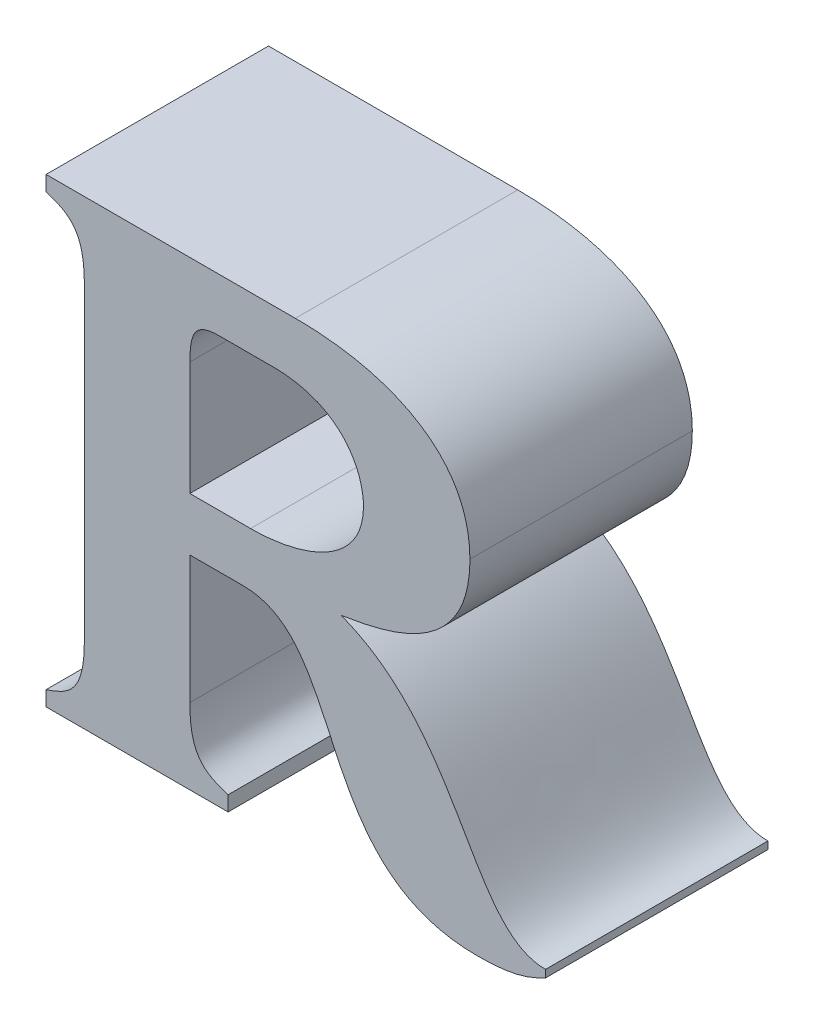
ISO-10303-21;
HEADER;
FILE_DESCRIPTION(('STEP AP214'),'2;1');
FILE_NAME('part.step','',(''),(''),'','','');
FILE_SCHEMA(('AUTOMOTIVE_DESIGN { 1 0 10303 214 1 1 1 1 }'));
ENDSEC;
DATA;
#1=APPLICATION_CONTEXT('core data for automotive mechanical design processes');
#2=APPLICATION_PROTOCOL_DEFINITION('international standard','automotive_design',2000,#1);
#3=PRODUCT_CONTEXT('',#1,'mechanical');
#4=PRODUCT('Part','Part','',(#3));
#5=PRODUCT_RELATED_PRODUCT_CATEGORY('part','',(#4));
#6=PRODUCT_DEFINITION_FORMATION('','',#4);
#7=PRODUCT_DEFINITION_CONTEXT('part definition',#1,'design');
#8=PRODUCT_DEFINITION('design','',#6,#7);
#9=PRODUCT_DEFINITION_SHAPE('','',#8);
#10=(LENGTH_UNIT() NAMED_UNIT(*) SI_UNIT(.MILLI.,.METRE.));
#11=(NAMED_UNIT(*) PLANE_ANGLE_UNIT() SI_UNIT($,.RADIAN.));
#12=(NAMED_UNIT(*) SI_UNIT($,.STERADIAN.) SOLID_ANGLE_UNIT());
#13=UNCERTAINTY_MEASURE_WITH_UNIT(LENGTH_MEASURE(1.E-05),#10,'distance_accuracy_value','');
#14=(GEOMETRIC_REPRESENTATION_CONTEXT(3) GLOBAL_UNCERTAINTY_ASSIGNED_CONTEXT((#13)) GLOBAL_UNIT_ASSIGNED_CONTEXT((#10,
#11,#12)) REPRESENTATION_CONTEXT('',''));
#15=CARTESIAN_POINT('',(0.,0.,0.));
#16=DIRECTION('',(0.,0.,1.));
#17=DIRECTION('',(1.,0.,0.));
#18=AXIS2_PLACEMENT_3D('',#15,#16,#17);
#19=CARTESIAN_POINT('',(1.597246785509,-0.29394706624691,0.));
#20=DIRECTION('',(-1.,0.,0.));
#21=DIRECTION('',(0.,-1.,0.));
#22=AXIS2_PLACEMENT_3D('',#19,#20,#21);
#23=PLANE('',#22);
#24=DIRECTION('',(0.,-1.,0.));
#25=VECTOR('',#24,1.);
#26=CARTESIAN_POINT('',(1.597246785509,-0.330388268107029,0.));
#27=LINE('',#26,#25);
#28=CARTESIAN_POINT('',(1.597246785509,-0.29394706624691,0.));
#29=VERTEX_POINT('',#28);
#30=CARTESIAN_POINT('',(1.597246785509,-0.345152450449,0.));
#31=VERTEX_POINT('',#30);
#32=EDGE_CURVE('E11',#29,#31,#27,.T.);
#33=ORIENTED_EDGE('',*,*,#32,.F.);
#34=DIRECTION('',(0.,0.,1.));
#35=VECTOR('',#34,1.);
#36=CARTESIAN_POINT('',(1.597246785509,-0.29394706624691,0.));
#37=LINE('',#36,#35);
#38=CARTESIAN_POINT('',(1.597246785509,-0.29394706624691,0.1));
#39=VERTEX_POINT('',#38);
#40=EDGE_CURVE('E24',#29,#39,#37,.T.);
#41=ORIENTED_EDGE('',*,*,#40,.T.);
#42=DIRECTION('',(0.,1.,0.));
#43=VECTOR('',#42,1.);
#44=CARTESIAN_POINT('',(1.597246785509,-0.330388268107029,0.1));
#45=LINE('',#44,#43);
#46=CARTESIAN_POINT('',(1.597246785509,-0.345152450449,0.1));
#47=VERTEX_POINT('',#46);
#48=EDGE_CURVE('E464',#47,#39,#45,.T.);
#49=ORIENTED_EDGE('',*,*,#48,.F.);
#50=DIRECTION('',(0.,0.,1.));
#51=VECTOR('',#50,1.);
#52=CARTESIAN_POINT('',(1.597246785509,-0.345152450449,0.));
#53=LINE('',#52,#51);
#54=EDGE_CURVE('E458',#31,#47,#53,.T.);
#55=ORIENTED_EDGE('',*,*,#54,.F.);
#56=EDGE_LOOP('',(#33,#41,#49,#55));
#57=FACE_BOUND('',#56,.T.);
#58=ADVANCED_FACE('F17',(#57),#23,.F.);
#59=CARTESIAN_POINT('',(1.611097839768,-0.27715841057491,0.));
#60=CARTESIAN_POINT('',(1.611097839768,-0.27715841057491,0.1));
#61=CARTESIAN_POINT('',(1.60060395514,-0.277158410574911,0.));
#62=CARTESIAN_POINT('',(1.60060395514,-0.277158410574911,0.1));
#63=CARTESIAN_POINT('',(1.597246785509,-0.280516079319981,0.));
#64=CARTESIAN_POINT('',(1.597246785509,-0.280516079319981,0.1));
#65=CARTESIAN_POINT('',(1.597246785509,-0.29394706624691,0.));
#66=CARTESIAN_POINT('',(1.597246785509,-0.29394706624691,0.1));
#67=B_SPLINE_SURFACE_WITH_KNOTS('',3,1,((#59,#60),(#61,#62),(#63,#64),(#65,#66)),.UNSPECIFIED.,
.F.,.F.,.F.,(4,4),(2,2),(-1.,0.),(0.,0.01),.UNSPECIFIED.);
#68=CARTESIAN_POINT('',(1.611097839768,-0.27715841057491,0.));
#69=CARTESIAN_POINT('',(1.60060395514,-0.277158410574911,0.));
#70=CARTESIAN_POINT('',(1.597246785509,-0.280516079319981,0.));
#71=CARTESIAN_POINT('',(1.597246785509,-0.29394706624691,0.));
#72=B_SPLINE_CURVE_WITH_KNOTS('',3,(#68,#69,#70,#71),.UNSPECIFIED.,.F.,.F.,(4,4),(-1.,0.),.UNSPECIFIED.);
#73=CARTESIAN_POINT('',(1.611097839768,-0.27715841057491,0.));
#74=VERTEX_POINT('',#73);
#75=EDGE_CURVE('E454',#74,#29,#72,.T.);
#76=DIRECTION('',(0.,0.,1.));
#77=VECTOR('',#76,1.);
#78=CARTESIAN_POINT('',(1.611097839768,-0.27715841057491,0.));
#79=LINE('',#78,#77);
#80=CARTESIAN_POINT('',(1.611097839768,-0.27715841057491,0.1));
#81=VERTEX_POINT('',#80);
#82=EDGE_CURVE('E448',#74,#81,#79,.T.);
#83=CARTESIAN_POINT('',(1.597246785509,-0.29394706624691,0.1));
#84=CARTESIAN_POINT('',(1.597246785509,-0.280516079319981,0.1));
#85=CARTESIAN_POINT('',(1.60060395514,-0.277158410574911,0.1));
#86=CARTESIAN_POINT('',(1.611097839768,-0.27715841057491,0.1));
#87=B_SPLINE_CURVE_WITH_KNOTS('',3,(#83,#84,#85,#86),.UNSPECIFIED.,.F.,.F.,(4,4),(0.,1.),.UNSPECIFIED.);
#88=EDGE_CURVE('E444',#39,#81,#87,.T.);
#89=ORIENTED_EDGE('',*,*,#75,.F.);
#90=ORIENTED_EDGE('',*,*,#82,.T.);
#91=ORIENTED_EDGE('',*,*,#88,.F.);
#92=ORIENTED_EDGE('',*,*,#40,.F.);
#93=EDGE_LOOP('',(#89,#90,#91,#92));
#94=FACE_BOUND('',#93,.T.);
#95=ADVANCED_FACE('F470',(#94),#67,.F.);
#96=CARTESIAN_POINT('',(1.634600834701,-0.27715841057491,0.));
#97=DIRECTION('',(0.,1.,0.));
#98=DIRECTION('',(-1.,0.,0.));
#99=AXIS2_PLACEMENT_3D('',#96,#97,#98);
#100=PLANE('',#99);
#101=DIRECTION('',(-1.,0.,0.));
#102=VECTOR('',#101,1.);
#103=CARTESIAN_POINT('',(1.630122014544,-0.27715841057491,0.));
#104=LINE('',#103,#102);
#105=CARTESIAN_POINT('',(1.634600834701,-0.27715841057491,0.));
#106=VERTEX_POINT('',#105);
#107=EDGE_CURVE('E441',#106,#74,#104,.T.);
#108=ORIENTED_EDGE('',*,*,#107,.F.);
#109=DIRECTION('',(0.,0.,1.));
#110=VECTOR('',#109,1.);
#111=CARTESIAN_POINT('',(1.634600834701,-0.27715841057491,0.));
#112=LINE('',#111,#110);
#113=CARTESIAN_POINT('',(1.634600834701,-0.27715841057491,0.1));
#114=VERTEX_POINT('',#113);
#115=EDGE_CURVE('E439',#106,#114,#112,.T.);
#116=ORIENTED_EDGE('',*,*,#115,.T.);
#117=DIRECTION('',(1.,0.,0.));
#118=VECTOR('',#117,1.);
#119=CARTESIAN_POINT('',(1.630122014544,-0.27715841057491,0.1));
#120=LINE('',#119,#118);
#121=EDGE_CURVE('E433',#81,#114,#120,.T.);
#122=ORIENTED_EDGE('',*,*,#121,.F.);
#123=ORIENTED_EDGE('',*,*,#82,.F.);
#124=EDGE_LOOP('',(#108,#116,#122,#123));
#125=FACE_BOUND('',#124,.T.);
#126=ADVANCED_FACE('F473',(#125),#100,.F.);
#127=CARTESIAN_POINT('',(1.675314549096,-0.311155446109,0.));
#128=CARTESIAN_POINT('',(1.675314549096,-0.311155446109,0.1));
#129=CARTESIAN_POINT('',(1.675314549096,-0.29730473499199,0.));
#130=CARTESIAN_POINT('',(1.675314549096,-0.29730473499199,0.1));
#131=CARTESIAN_POINT('',(1.665240856578,-0.27715841057491,0.));
#132=CARTESIAN_POINT('',(1.665240856578,-0.27715841057491,0.1));
#133=CARTESIAN_POINT('',(1.634600834701,-0.27715841057491,0.));
#134=CARTESIAN_POINT('',(1.634600834701,-0.27715841057491,0.1));
#135=B_SPLINE_SURFACE_WITH_KNOTS('',3,1,((#127,#128),(#129,#130),(#131,#132),(#133,#134)),
.UNSPECIFIED.,.F.,.F.,.F.,(4,4),(2,2),(-1.,0.),(0.,0.01),.UNSPECIFIED.);
#136=CARTESIAN_POINT('',(1.675314549096,-0.311155446109,0.));
#137=CARTESIAN_POINT('',(1.675314549096,-0.29730473499199,0.));
#138=CARTESIAN_POINT('',(1.665240856578,-0.27715841057491,0.));
#139=CARTESIAN_POINT('',(1.634600834701,-0.27715841057491,0.));
#140=B_SPLINE_CURVE_WITH_KNOTS('',3,(#136,#137,#138,#139),.UNSPECIFIED.,.F.,.F.,(4,4),(-1.,0.),.UNSPECIFIED.);
#141=CARTESIAN_POINT('',(1.675314549096,-0.311155446109,0.));
#142=VERTEX_POINT('',#141);
#143=EDGE_CURVE('E428',#142,#106,#140,.T.);
#144=DIRECTION('',(0.,0.,1.));
#145=VECTOR('',#144,1.);
#146=CARTESIAN_POINT('',(1.675314549096,-0.311155446109,0.));
#147=LINE('',#146,#145);
#148=CARTESIAN_POINT('',(1.675314549096,-0.311155446109,0.1));
#149=VERTEX_POINT('',#148);
#150=EDGE_CURVE('E422',#142,#149,#147,.T.);
#151=CARTESIAN_POINT('',(1.634600834701,-0.27715841057491,0.1));
#152=CARTESIAN_POINT('',(1.665240856578,-0.27715841057491,0.1));
#153=CARTESIAN_POINT('',(1.675314549096,-0.29730473499199,0.1));
#154=CARTESIAN_POINT('',(1.675314549096,-0.311155446109,0.1));
#155=B_SPLINE_CURVE_WITH_KNOTS('',3,(#151,#152,#153,#154),.UNSPECIFIED.,.F.,.F.,(4,4),(0.,1.),.UNSPECIFIED.);
#156=EDGE_CURVE('E415',#114,#149,#155,.T.);
#157=ORIENTED_EDGE('',*,*,#143,.F.);
#158=ORIENTED_EDGE('',*,*,#150,.T.);
#159=ORIENTED_EDGE('',*,*,#156,.F.);
#160=ORIENTED_EDGE('',*,*,#115,.F.);
#161=EDGE_LOOP('',(#157,#158,#159,#160));
#162=FACE_BOUND('',#161,.T.);
#163=ADVANCED_FACE('F478',(#162),#135,.F.);
#164=CARTESIAN_POINT('',(1.62452838997,-0.345152450449,0.));
#165=CARTESIAN_POINT('',(1.62452838997,-0.345152450449,0.1));
#166=CARTESIAN_POINT('',(1.648451577013,-0.345152450449,0.));
#167=CARTESIAN_POINT('',(1.648451577013,-0.345152450449,0.1));
#168=CARTESIAN_POINT('',(1.675314549096,-0.335079288241,0.));
#169=CARTESIAN_POINT('',(1.675314549096,-0.335079288241,0.1));
#170=CARTESIAN_POINT('',(1.675314549096,-0.311155446109,0.));
#171=CARTESIAN_POINT('',(1.675314549096,-0.311155446109,0.1));
#172=B_SPLINE_SURFACE_WITH_KNOTS('',3,1,((#164,#165),(#166,#167),(#168,#169),(#170,#171)),
.UNSPECIFIED.,.F.,.F.,.F.,(4,4),(2,2),(-1.,0.),(0.,0.01),.UNSPECIFIED.);
#173=CARTESIAN_POINT('',(1.62452838997,-0.345152450449,0.));
#174=CARTESIAN_POINT('',(1.648451577013,-0.345152450449,0.));
#175=CARTESIAN_POINT('',(1.675314549096,-0.335079288241,0.));
#176=CARTESIAN_POINT('',(1.675314549096,-0.311155446109,0.));
#177=B_SPLINE_CURVE_WITH_KNOTS('',3,(#173,#174,#175,#176),.UNSPECIFIED.,.F.,.F.,(4,4),(-1.,0.),.UNSPECIFIED.);
#178=CARTESIAN_POINT('',(1.62452838997,-0.345152450449,0.));
#179=VERTEX_POINT('',#178);
#180=EDGE_CURVE('E410',#179,#142,#177,.T.);
#181=DIRECTION('',(0.,0.,1.));
#182=VECTOR('',#181,1.);
#183=CARTESIAN_POINT('',(1.62452838997,-0.345152450449,0.));
#184=LINE('',#183,#182);
#185=CARTESIAN_POINT('',(1.62452838997,-0.345152450449,0.1));
#186=VERTEX_POINT('',#185);
#187=EDGE_CURVE('E404',#179,#186,#184,.T.);
#188=CARTESIAN_POINT('',(1.675314549096,-0.311155446109,0.1));
#189=CARTESIAN_POINT('',(1.675314549096,-0.335079288241,0.1));
#190=CARTESIAN_POINT('',(1.648451577013,-0.345152450449,0.1));
#191=CARTESIAN_POINT('',(1.62452838997,-0.345152450449,0.1));
#192=B_SPLINE_CURVE_WITH_KNOTS('',3,(#188,#189,#190,#191),.UNSPECIFIED.,.F.,.F.,(4,4),(0.,1.),.UNSPECIFIED.);
#193=EDGE_CURVE('E400',#149,#186,#192,.T.);
#194=ORIENTED_EDGE('',*,*,#180,.F.);
#195=ORIENTED_EDGE('',*,*,#187,.T.);
#196=ORIENTED_EDGE('',*,*,#193,.F.);
#197=ORIENTED_EDGE('',*,*,#150,.F.);
#198=EDGE_LOOP('',(#194,#195,#196,#197));
#199=FACE_BOUND('',#198,.T.);
#200=ADVANCED_FACE('F482',(#199),#172,.F.);
#201=CARTESIAN_POINT('',(1.597246785509,-0.345152450449,0.));
#202=DIRECTION('',(0.,-1.,0.));
#203=DIRECTION('',(1.,0.,0.));
#204=AXIS2_PLACEMENT_3D('',#201,#202,#203);
#205=PLANE('',#204);
#206=DIRECTION('',(1.,0.,0.));
#207=VECTOR('',#206,1.);
#208=CARTESIAN_POINT('',(1.611444989948,-0.345152450449,0.));
#209=LINE('',#208,#207);
#210=EDGE_CURVE('E398',#31,#179,#209,.T.);
#211=ORIENTED_EDGE('',*,*,#210,.F.);
#212=ORIENTED_EDGE('',*,*,#54,.T.);
#213=DIRECTION('',(-1.,0.,0.));
#214=VECTOR('',#213,1.);
#215=CARTESIAN_POINT('',(1.611444989948,-0.345152450449,0.1));
#216=LINE('',#215,#214);
#217=EDGE_CURVE('E392',#186,#47,#216,.T.);
#218=ORIENTED_EDGE('',*,*,#217,.F.);
#219=ORIENTED_EDGE('',*,*,#187,.F.);
#220=EDGE_LOOP('',(#211,#212,#218,#219));
#221=FACE_BOUND('',#220,.T.);
#222=ADVANCED_FACE('F485',(#221),#205,.F.);
#223=CARTESIAN_POINT('',(1.723162170969,-0.307797621391,0.));
#224=CARTESIAN_POINT('',(1.723162170969,-0.307797621391,0.1));
#225=CARTESIAN_POINT('',(1.723162170969,-0.27044291711144,0.));
#226=CARTESIAN_POINT('',(1.723162170969,-0.27044291711144,0.1));
#227=CARTESIAN_POINT('',(1.689164043622,-0.25323453724898,0.));
#228=CARTESIAN_POINT('',(1.689164043622,-0.25323453724898,0.1));
#229=CARTESIAN_POINT('',(1.644674527219,-0.25323453724898,0.));
#230=CARTESIAN_POINT('',(1.644674527219,-0.25323453724898,0.1));
#231=B_SPLINE_SURFACE_WITH_KNOTS('',3,1,((#223,#224),(#225,#226),(#227,#228),(#229,#230)),
.UNSPECIFIED.,.F.,.F.,.F.,(4,4),(2,2),(-1.,0.),(0.,0.01),.UNSPECIFIED.);
#232=CARTESIAN_POINT('',(1.644674527219,-0.25323453724898,0.));
#233=CARTESIAN_POINT('',(1.689164043622,-0.25323453724898,0.));
#234=CARTESIAN_POINT('',(1.723162170969,-0.27044291711144,0.));
#235=CARTESIAN_POINT('',(1.723162170969,-0.307797621391,0.));
#236=B_SPLINE_CURVE_WITH_KNOTS('',3,(#232,#233,#234,#235),.UNSPECIFIED.,.F.,.F.,(4,4),(0.,1.),.UNSPECIFIED.);
#237=CARTESIAN_POINT('',(1.644674527219,-0.25323453724898,0.));
#238=VERTEX_POINT('',#237);
#239=CARTESIAN_POINT('',(1.723162170969,-0.307797621391,0.));
#240=VERTEX_POINT('',#239);
#241=EDGE_CURVE('E388',#238,#240,#236,.T.);
#242=DIRECTION('',(0.,0.,1.));
#243=VECTOR('',#242,1.);
#244=CARTESIAN_POINT('',(1.644674527219,-0.25323453724898,0.));
#245=LINE('',#244,#243);
#246=CARTESIAN_POINT('',(1.644674527219,-0.25323453724898,0.1));
#247=VERTEX_POINT('',#246);
#248=EDGE_CURVE('E383',#238,#247,#245,.T.);
#249=CARTESIAN_POINT('',(1.723162170969,-0.307797621391,0.1));
#250=CARTESIAN_POINT('',(1.723162170969,-0.27044291711144,0.1));
#251=CARTESIAN_POINT('',(1.689164043622,-0.25323453724898,0.1));
#252=CARTESIAN_POINT('',(1.644674527219,-0.25323453724898,0.1));
#253=B_SPLINE_CURVE_WITH_KNOTS('',3,(#249,#250,#251,#252),.UNSPECIFIED.,.F.,.F.,(4,4),(-1.,0.),.UNSPECIFIED.);
#254=CARTESIAN_POINT('',(1.723162170969,-0.307797621391,0.1));
#255=VERTEX_POINT('',#254);
#256=EDGE_CURVE('E194',#255,#247,#253,.T.);
#257=DIRECTION('',(0.,0.,1.));
#258=VECTOR('',#257,1.);
#259=CARTESIAN_POINT('',(1.723162170969,-0.307797621391,0.));
#260=LINE('',#259,#258);
#261=EDGE_CURVE('E374',#240,#255,#260,.T.);
#262=ORIENTED_EDGE('',*,*,#241,.F.);
#263=ORIENTED_EDGE('',*,*,#248,.T.);
#264=ORIENTED_EDGE('',*,*,#256,.F.);
#265=ORIENTED_EDGE('',*,*,#261,.F.);
#266=EDGE_LOOP('',(#262,#263,#264,#265));
#267=FACE_BOUND('',#266,.T.);
#268=ADVANCED_FACE('F533',(#267),#231,.T.);
#269=CARTESIAN_POINT('',(1.665240856578,-0.358583437376,0.));
#270=CARTESIAN_POINT('',(1.665240856578,-0.358583437376,0.1));
#271=CARTESIAN_POINT('',(1.685806873991,-0.355225643852,0.));
#272=CARTESIAN_POINT('',(1.685806873991,-0.355225643852,0.1));
#273=CARTESIAN_POINT('',(1.723162170969,-0.348510150389,0.));
#274=CARTESIAN_POINT('',(1.723162170969,-0.348510150389,0.1));
#275=CARTESIAN_POINT('',(1.723162170969,-0.307797621391,0.));
#276=CARTESIAN_POINT('',(1.723162170969,-0.307797621391,0.1));
#277=B_SPLINE_SURFACE_WITH_KNOTS('',3,1,((#269,#270),(#271,#272),(#273,#274),(#275,#276)),
.UNSPECIFIED.,.F.,.F.,.F.,(4,4),(2,2),(-1.,0.),(0.,0.01),.UNSPECIFIED.);
#278=CARTESIAN_POINT('',(1.723162170969,-0.307797621391,0.));
#279=CARTESIAN_POINT('',(1.723162170969,-0.348510150389,0.));
#280=CARTESIAN_POINT('',(1.685806873991,-0.355225643852,0.));
#281=CARTESIAN_POINT('',(1.665240856578,-0.358583437376,0.));
#282=B_SPLINE_CURVE_WITH_KNOTS('',3,(#278,#279,#280,#281),.UNSPECIFIED.,.F.,.F.,(4,4),(0.,1.),.UNSPECIFIED.);
#283=CARTESIAN_POINT('',(1.665240856578,-0.358583437376,0.));
#284=VERTEX_POINT('',#283);
#285=EDGE_CURVE('E367',#240,#284,#282,.T.);
#286=CARTESIAN_POINT('',(1.665240856578,-0.358583437376,0.1));
#287=CARTESIAN_POINT('',(1.685806873991,-0.355225643852,0.1));
#288=CARTESIAN_POINT('',(1.723162170969,-0.348510150389,0.1));
#289=CARTESIAN_POINT('',(1.723162170969,-0.307797621391,0.1));
#290=B_SPLINE_CURVE_WITH_KNOTS('',3,(#286,#287,#288,#289),.UNSPECIFIED.,.F.,.F.,(4,4),(-1.,0.),.UNSPECIFIED.);
#291=CARTESIAN_POINT('',(1.665240856578,-0.358583437376,0.1));
#292=VERTEX_POINT('',#291);
#293=EDGE_CURVE('E363',#292,#255,#290,.T.);
#294=DIRECTION('',(0.,0.,1.));
#295=VECTOR('',#294,1.);
#296=CARTESIAN_POINT('',(1.665240856578,-0.358583437376,0.));
#297=LINE('',#296,#295);
#298=EDGE_CURVE('E357',#284,#292,#297,.T.);
#299=ORIENTED_EDGE('',*,*,#285,.F.);
#300=ORIENTED_EDGE('',*,*,#261,.T.);
#301=ORIENTED_EDGE('',*,*,#293,.F.);
#302=ORIENTED_EDGE('',*,*,#298,.F.);
#303=EDGE_LOOP('',(#299,#300,#301,#302));
#304=FACE_BOUND('',#303,.T.);
#305=ADVANCED_FACE('F538',(#304),#277,.T.);
#306=CARTESIAN_POINT('',(1.75715905053,-0.450501256992,0.));
#307=CARTESIAN_POINT('',(1.75715905053,-0.450501256992,0.1));
#308=CARTESIAN_POINT('',(1.723162170969,-0.450501256992,0.));
#309=CARTESIAN_POINT('',(1.723162170969,-0.450501256992,0.1));
#310=CARTESIAN_POINT('',(1.719803753552,-0.379149485984,0.));
#311=CARTESIAN_POINT('',(1.719803753552,-0.379149485984,0.1));
#312=CARTESIAN_POINT('',(1.665240856578,-0.358583437376,0.));
#313=CARTESIAN_POINT('',(1.665240856578,-0.358583437376,0.1));
#314=B_SPLINE_SURFACE_WITH_KNOTS('',3,1,((#306,#307),(#308,#309),(#310,#311),(#312,#313)),
.UNSPECIFIED.,.F.,.F.,.F.,(4,4),(2,2),(-1.,0.),(0.,0.01),.UNSPECIFIED.);
#315=CARTESIAN_POINT('',(1.665240856578,-0.358583437376,0.));
#316=CARTESIAN_POINT('',(1.719803753552,-0.379149485984,0.));
#317=CARTESIAN_POINT('',(1.723162170969,-0.450501256992,0.));
#318=CARTESIAN_POINT('',(1.75715905053,-0.450501256992,0.));
#319=B_SPLINE_CURVE_WITH_KNOTS('',3,(#315,#316,#317,#318),.UNSPECIFIED.,.F.,.F.,(4,4),(0.,1.),.UNSPECIFIED.);
#320=CARTESIAN_POINT('',(1.75715905053,-0.450501256992,0.));
#321=VERTEX_POINT('',#320);
#322=EDGE_CURVE('E350',#284,#321,#319,.T.);
#323=CARTESIAN_POINT('',(1.75715905053,-0.450501256992,0.1));
#324=CARTESIAN_POINT('',(1.723162170969,-0.450501256992,0.1));
#325=CARTESIAN_POINT('',(1.719803753552,-0.379149485984,0.1));
#326=CARTESIAN_POINT('',(1.665240856578,-0.358583437376,0.1));
#327=B_SPLINE_CURVE_WITH_KNOTS('',3,(#323,#324,#325,#326),.UNSPECIFIED.,.F.,.F.,(4,4),(-1.,0.),.UNSPECIFIED.);
#328=CARTESIAN_POINT('',(1.75715905053,-0.450501256992,0.1));
#329=VERTEX_POINT('',#328);
#330=EDGE_CURVE('E345',#329,#292,#327,.T.);
#331=DIRECTION('',(0.,0.,1.));
#332=VECTOR('',#331,1.);
#333=CARTESIAN_POINT('',(1.75715905053,-0.450501256992,0.));
#334=LINE('',#333,#332);
#335=EDGE_CURVE('E342',#321,#329,#334,.T.);
#336=ORIENTED_EDGE('',*,*,#322,.F.);
#337=ORIENTED_EDGE('',*,*,#298,.T.);
#338=ORIENTED_EDGE('',*,*,#330,.F.);
#339=ORIENTED_EDGE('',*,*,#335,.F.);
#340=EDGE_LOOP('',(#336,#337,#338,#339));
#341=FACE_BOUND('',#340,.T.);
#342=ADVANCED_FACE('F549',(#341),#314,.T.);
#343=CARTESIAN_POINT('',(1.75715905053,-0.453859050516,0.));
#344=DIRECTION('',(1.,0.,0.));
#345=DIRECTION('',(0.,1.,0.));
#346=AXIS2_PLACEMENT_3D('',#343,#344,#345);
#347=PLANE('',#346);
#348=DIRECTION('',(0.,-1.,0.));
#349=VECTOR('',#348,1.);
#350=CARTESIAN_POINT('',(1.75715905053,-0.450501256992,0.));
#351=LINE('',#350,#349);
#352=CARTESIAN_POINT('',(1.75715905053,-0.453859050516,0.));
#353=VERTEX_POINT('',#352);
#354=EDGE_CURVE('E340',#321,#353,#351,.T.);
#355=ORIENTED_EDGE('',*,*,#354,.F.);
#356=ORIENTED_EDGE('',*,*,#335,.T.);
#357=DIRECTION('',(0.,1.,0.));
#358=VECTOR('',#357,1.);
#359=CARTESIAN_POINT('',(1.75715905053,-0.450501256992,0.1));
#360=LINE('',#359,#358);
#361=CARTESIAN_POINT('',(1.75715905053,-0.453859050516,0.1));
#362=VERTEX_POINT('',#361);
#363=EDGE_CURVE('E337',#362,#329,#360,.T.);
#364=ORIENTED_EDGE('',*,*,#363,.F.);
#365=DIRECTION('',(0.,0.,1.));
#366=VECTOR('',#365,1.);
#367=CARTESIAN_POINT('',(1.75715905053,-0.453859050516,0.));
#368=LINE('',#367,#366);
#369=EDGE_CURVE('E331',#353,#362,#368,.T.);
#370=ORIENTED_EDGE('',*,*,#369,.F.);
#371=EDGE_LOOP('',(#355,#356,#364,#370));
#372=FACE_BOUND('',#371,.T.);
#373=ADVANCED_FACE('F560',(#372),#347,.T.);
#374=CARTESIAN_POINT('',(1.7265193406,-0.46057454398,0.));
#375=CARTESIAN_POINT('',(1.7265193406,-0.46057454398,0.1));
#376=CARTESIAN_POINT('',(1.743727252542,-0.46057454398,0.));
#377=CARTESIAN_POINT('',(1.743727252542,-0.46057454398,0.1));
#378=CARTESIAN_POINT('',(1.75044377543,-0.457216719261,0.));
#379=CARTESIAN_POINT('',(1.75044377543,-0.457216719261,0.1));
#380=CARTESIAN_POINT('',(1.75715905053,-0.453859050516,0.));
#381=CARTESIAN_POINT('',(1.75715905053,-0.453859050516,0.1));
#382=B_SPLINE_SURFACE_WITH_KNOTS('',3,1,((#374,#375),(#376,#377),(#378,#379),(#380,#381)),
.UNSPECIFIED.,.F.,.F.,.F.,(4,4),(2,2),(-1.,0.),(0.,0.01),.UNSPECIFIED.);
#383=CARTESIAN_POINT('',(1.75715905053,-0.453859050516,0.));
#384=CARTESIAN_POINT('',(1.75044377543,-0.457216719261,0.));
#385=CARTESIAN_POINT('',(1.743727252542,-0.46057454398,0.));
#386=CARTESIAN_POINT('',(1.7265193406,-0.46057454398,0.));
#387=B_SPLINE_CURVE_WITH_KNOTS('',3,(#383,#384,#385,#386),.UNSPECIFIED.,.F.,.F.,(4,4),(0.,1.),.UNSPECIFIED.);
#388=CARTESIAN_POINT('',(1.7265193406,-0.46057454398,0.));
#389=VERTEX_POINT('',#388);
#390=EDGE_CURVE('E324',#353,#389,#387,.T.);
#391=CARTESIAN_POINT('',(1.7265193406,-0.46057454398,0.1));
#392=CARTESIAN_POINT('',(1.743727252542,-0.46057454398,0.1));
#393=CARTESIAN_POINT('',(1.75044377543,-0.457216719261,0.1));
#394=CARTESIAN_POINT('',(1.75715905053,-0.453859050516,0.1));
#395=B_SPLINE_CURVE_WITH_KNOTS('',3,(#391,#392,#393,#394),.UNSPECIFIED.,.F.,.F.,(4,4),(-1.,0.),.UNSPECIFIED.);
#396=CARTESIAN_POINT('',(1.7265193406,-0.46057454398,0.1));
#397=VERTEX_POINT('',#396);
#398=EDGE_CURVE('E319',#397,#362,#395,.T.);
#399=DIRECTION('',(0.,0.,1.));
#400=VECTOR('',#399,1.);
#401=CARTESIAN_POINT('',(1.7265193406,-0.46057454398,0.));
#402=LINE('',#401,#400);
#403=EDGE_CURVE('E313',#389,#397,#402,.T.);
#404=ORIENTED_EDGE('',*,*,#390,.F.);
#405=ORIENTED_EDGE('',*,*,#369,.T.);
#406=ORIENTED_EDGE('',*,*,#398,.F.);
#407=ORIENTED_EDGE('',*,*,#403,.F.);
#408=EDGE_LOOP('',(#404,#405,#406,#407));
#409=FACE_BOUND('',#408,.T.);
#410=ADVANCED_FACE('F569',(#409),#382,.T.);
#411=CARTESIAN_POINT('',(1.621170284499,-0.369076323775,0.));
#412=CARTESIAN_POINT('',(1.621170284499,-0.369076323775,0.1));
#413=CARTESIAN_POINT('',(1.668597714262,-0.369076323775,0.));
#414=CARTESIAN_POINT('',(1.668597714262,-0.369076323775,0.1));
#415=CARTESIAN_POINT('',(1.65180999443,-0.46057454398,0.));
#416=CARTESIAN_POINT('',(1.65180999443,-0.46057454398,0.1));
#417=CARTESIAN_POINT('',(1.7265193406,-0.46057454398,0.));
#418=CARTESIAN_POINT('',(1.7265193406,-0.46057454398,0.1));
#419=B_SPLINE_SURFACE_WITH_KNOTS('',3,1,((#411,#412),(#413,#414),(#415,#416),(#417,#418)),
.UNSPECIFIED.,.F.,.F.,.F.,(4,4),(2,2),(-1.,0.),(0.,0.01),.UNSPECIFIED.);
#420=CARTESIAN_POINT('',(1.7265193406,-0.46057454398,0.));
#421=CARTESIAN_POINT('',(1.65180999443,-0.46057454398,0.));
#422=CARTESIAN_POINT('',(1.668597714262,-0.369076323775,0.));
#423=CARTESIAN_POINT('',(1.621170284499,-0.369076323775,0.));
#424=B_SPLINE_CURVE_WITH_KNOTS('',3,(#420,#421,#422,#423),.UNSPECIFIED.,.F.,.F.,(4,4),(0.,1.),.UNSPECIFIED.);
#425=CARTESIAN_POINT('',(1.621170284499,-0.369076323775,0.));
#426=VERTEX_POINT('',#425);
#427=EDGE_CURVE('E306',#389,#426,#424,.T.);
#428=CARTESIAN_POINT('',(1.621170284499,-0.369076323775,0.1));
#429=CARTESIAN_POINT('',(1.668597714262,-0.369076323775,0.1));
#430=CARTESIAN_POINT('',(1.65180999443,-0.46057454398,0.1));
#431=CARTESIAN_POINT('',(1.7265193406,-0.46057454398,0.1));
#432=B_SPLINE_CURVE_WITH_KNOTS('',3,(#428,#429,#430,#431),.UNSPECIFIED.,.F.,.F.,(4,4),(-1.,0.),.UNSPECIFIED.);
#433=CARTESIAN_POINT('',(1.621170284499,-0.369076323775,0.1));
#434=VERTEX_POINT('',#433);
#435=EDGE_CURVE('E301',#434,#397,#432,.T.);
#436=DIRECTION('',(0.,0.,1.));
#437=VECTOR('',#436,1.);
#438=CARTESIAN_POINT('',(1.621170284499,-0.369076323775,0.));
#439=LINE('',#438,#437);
#440=EDGE_CURVE('E298',#426,#434,#439,.T.);
#441=ORIENTED_EDGE('',*,*,#427,.F.);
#442=ORIENTED_EDGE('',*,*,#403,.T.);
#443=ORIENTED_EDGE('',*,*,#435,.F.);
#444=ORIENTED_EDGE('',*,*,#440,.F.);
#445=EDGE_LOOP('',(#441,#442,#443,#444));
#446=FACE_BOUND('',#445,.T.);
#447=ADVANCED_FACE('F575',(#446),#419,.T.);
#448=CARTESIAN_POINT('',(1.597246785509,-0.369076323775,0.));
#449=DIRECTION('',(0.,-1.,0.));
#450=DIRECTION('',(1.,0.,0.));
#451=AXIS2_PLACEMENT_3D('',#448,#449,#450);
#452=PLANE('',#451);
#453=DIRECTION('',(-1.,0.,0.));
#454=VECTOR('',#453,1.);
#455=CARTESIAN_POINT('',(1.621170284499,-0.369076323775,0.));
#456=LINE('',#455,#454);
#457=CARTESIAN_POINT('',(1.597246785509,-0.369076323775,0.));
#458=VERTEX_POINT('',#457);
#459=EDGE_CURVE('E296',#426,#458,#456,.T.);
#460=ORIENTED_EDGE('',*,*,#459,.F.);
#461=ORIENTED_EDGE('',*,*,#440,.T.);
#462=DIRECTION('',(1.,0.,0.));
#463=VECTOR('',#462,1.);
#464=CARTESIAN_POINT('',(1.621170284499,-0.369076323775,0.1));
#465=LINE('',#464,#463);
#466=CARTESIAN_POINT('',(1.597246785509,-0.369076323775,0.1));
#467=VERTEX_POINT('',#466);
#468=EDGE_CURVE('E293',#467,#434,#465,.T.);
#469=ORIENTED_EDGE('',*,*,#468,.F.);
#470=DIRECTION('',(0.,0.,1.));
#471=VECTOR('',#470,1.);
#472=CARTESIAN_POINT('',(1.597246785509,-0.369076323775,0.));
#473=LINE('',#472,#471);
#474=EDGE_CURVE('E290',#458,#467,#473,.T.);
#475=ORIENTED_EDGE('',*,*,#474,.F.);
#476=EDGE_LOOP('',(#460,#461,#469,#475));
#477=FACE_BOUND('',#476,.T.);
#478=ADVANCED_FACE('F586',(#477),#452,.T.);
#479=CARTESIAN_POINT('',(1.597246785509,-0.426577508445,0.));
#480=DIRECTION('',(1.,0.,0.));
#481=DIRECTION('',(0.,1.,0.));
#482=AXIS2_PLACEMENT_3D('',#479,#480,#481);
#483=PLANE('',#482);
#484=DIRECTION('',(0.,-1.,0.));
#485=VECTOR('',#484,1.);
#486=CARTESIAN_POINT('',(1.597246785509,-0.369076323775,0.));
#487=LINE('',#486,#485);
#488=CARTESIAN_POINT('',(1.597246785509,-0.426577508445,0.));
#489=VERTEX_POINT('',#488);
#490=EDGE_CURVE('E288',#458,#489,#487,.T.);
#491=ORIENTED_EDGE('',*,*,#490,.F.);
#492=ORIENTED_EDGE('',*,*,#474,.T.);
#493=DIRECTION('',(0.,1.,0.));
#494=VECTOR('',#493,1.);
#495=CARTESIAN_POINT('',(1.597246785509,-0.369076323775,0.1));
#496=LINE('',#495,#494);
#497=CARTESIAN_POINT('',(1.597246785509,-0.426577508445,0.1));
#498=VERTEX_POINT('',#497);
#499=EDGE_CURVE('E285',#498,#467,#496,.T.);
#500=ORIENTED_EDGE('',*,*,#499,.F.);
#501=DIRECTION('',(0.,0.,1.));
#502=VECTOR('',#501,1.);
#503=CARTESIAN_POINT('',(1.597246785509,-0.426577508445,0.));
#504=LINE('',#503,#502);
#505=EDGE_CURVE('E279',#489,#498,#504,.T.);
#506=ORIENTED_EDGE('',*,*,#505,.F.);
#507=EDGE_LOOP('',(#491,#492,#500,#506));
#508=FACE_BOUND('',#507,.T.);
#509=ADVANCED_FACE('F595',(#508),#483,.T.);
#510=CARTESIAN_POINT('',(1.614454697452,-0.453859050516,0.));
#511=CARTESIAN_POINT('',(1.614454697452,-0.453859050516,0.1));
#512=CARTESIAN_POINT('',(1.603962372557,-0.450501256992,0.));
#513=CARTESIAN_POINT('',(1.603962372557,-0.450501256992,0.1));
#514=CARTESIAN_POINT('',(1.597246785509,-0.447143557053,0.));
#515=CARTESIAN_POINT('',(1.597246785509,-0.447143557053,0.1));
#516=CARTESIAN_POINT('',(1.597246785509,-0.426577508445,0.));
#517=CARTESIAN_POINT('',(1.597246785509,-0.426577508445,0.1));
#518=B_SPLINE_SURFACE_WITH_KNOTS('',3,1,((#510,#511),(#512,#513),(#514,#515),(#516,#517)),
.UNSPECIFIED.,.F.,.F.,.F.,(4,4),(2,2),(-1.,0.),(0.,0.01),.UNSPECIFIED.);
#519=CARTESIAN_POINT('',(1.597246785509,-0.426577508445,0.));
#520=CARTESIAN_POINT('',(1.597246785509,-0.447143557053,0.));
#521=CARTESIAN_POINT('',(1.603962372557,-0.450501256992,0.));
#522=CARTESIAN_POINT('',(1.614454697452,-0.453859050516,0.));
#523=B_SPLINE_CURVE_WITH_KNOTS('',3,(#519,#520,#521,#522),.UNSPECIFIED.,.F.,.F.,(4,4),(0.,1.),.UNSPECIFIED.);
#524=CARTESIAN_POINT('',(1.614454697452,-0.453859050516,0.));
#525=VERTEX_POINT('',#524);
#526=EDGE_CURVE('E272',#489,#525,#523,.T.);
#527=CARTESIAN_POINT('',(1.614454697452,-0.453859050516,0.1));
#528=CARTESIAN_POINT('',(1.603962372557,-0.450501256992,0.1));
#529=CARTESIAN_POINT('',(1.597246785509,-0.447143557053,0.1));
#530=CARTESIAN_POINT('',(1.597246785509,-0.426577508445,0.1));
#531=B_SPLINE_CURVE_WITH_KNOTS('',3,(#527,#528,#529,#530),.UNSPECIFIED.,.F.,.F.,(4,4),(-1.,0.),.UNSPECIFIED.);
#532=CARTESIAN_POINT('',(1.614454697452,-0.453859050516,0.1));
#533=VERTEX_POINT('',#532);
#534=EDGE_CURVE('E267',#533,#498,#531,.T.);
#535=DIRECTION('',(0.,0.,1.));
#536=VECTOR('',#535,1.);
#537=CARTESIAN_POINT('',(1.614454697452,-0.453859050516,0.));
#538=LINE('',#537,#536);
#539=EDGE_CURVE('E264',#525,#533,#538,.T.);
#540=ORIENTED_EDGE('',*,*,#526,.F.);
#541=ORIENTED_EDGE('',*,*,#505,.T.);
#542=ORIENTED_EDGE('',*,*,#534,.F.);
#543=ORIENTED_EDGE('',*,*,#539,.F.);
#544=EDGE_LOOP('',(#540,#541,#542,#543));
#545=FACE_BOUND('',#544,.T.);
#546=ADVANCED_FACE('F599',(#545),#518,.T.);
#547=CARTESIAN_POINT('',(1.614454697452,-0.46057454398,0.));
#548=DIRECTION('',(1.,0.,0.));
#549=DIRECTION('',(0.,1.,0.));
#550=AXIS2_PLACEMENT_3D('',#547,#548,#549);
#551=PLANE('',#550);
#552=DIRECTION('',(0.,-1.,0.));
#553=VECTOR('',#552,1.);
#554=CARTESIAN_POINT('',(1.614454697452,-0.453859050516,0.));
#555=LINE('',#554,#553);
#556=CARTESIAN_POINT('',(1.614454697452,-0.46057454398,0.));
#557=VERTEX_POINT('',#556);
#558=EDGE_CURVE('E262',#525,#557,#555,.T.);
#559=ORIENTED_EDGE('',*,*,#558,.F.);
#560=ORIENTED_EDGE('',*,*,#539,.T.);
#561=DIRECTION('',(0.,1.,0.));
#562=VECTOR('',#561,1.);
#563=CARTESIAN_POINT('',(1.614454697452,-0.453859050516,0.1));
#564=LINE('',#563,#562);
#565=CARTESIAN_POINT('',(1.614454697452,-0.46057454398,0.1));
#566=VERTEX_POINT('',#565);
#567=EDGE_CURVE('E259',#566,#533,#564,.T.);
#568=ORIENTED_EDGE('',*,*,#567,.F.);
#569=DIRECTION('',(0.,0.,1.));
#570=VECTOR('',#569,1.);
#571=CARTESIAN_POINT('',(1.614454697452,-0.46057454398,0.));
#572=LINE('',#571,#570);
#573=EDGE_CURVE('E256',#557,#566,#572,.T.);
#574=ORIENTED_EDGE('',*,*,#573,.F.);
#575=EDGE_LOOP('',(#559,#560,#568,#574));
#576=FACE_BOUND('',#575,.T.);
#577=ADVANCED_FACE('F605',(#576),#551,.T.);
#578=CARTESIAN_POINT('',(1.532610196017,-0.46057454398,0.));
#579=DIRECTION('',(0.,-1.,0.));
#580=DIRECTION('',(1.,0.,0.));
#581=AXIS2_PLACEMENT_3D('',#578,#579,#580);
#582=PLANE('',#581);
#583=DIRECTION('',(-1.,0.,0.));
#584=VECTOR('',#583,1.);
#585=CARTESIAN_POINT('',(1.614454697452,-0.46057454398,0.));
#586=LINE('',#585,#584);
#587=CARTESIAN_POINT('',(1.532610196017,-0.46057454398,0.));
#588=VERTEX_POINT('',#587);
#589=EDGE_CURVE('E254',#557,#588,#586,.T.);
#590=ORIENTED_EDGE('',*,*,#589,.F.);
#591=ORIENTED_EDGE('',*,*,#573,.T.);
#592=DIRECTION('',(1.,0.,0.));
#593=VECTOR('',#592,1.);
#594=CARTESIAN_POINT('',(1.614454697452,-0.46057454398,0.1));
#595=LINE('',#594,#593);
#596=CARTESIAN_POINT('',(1.532610196017,-0.46057454398,0.1));
#597=VERTEX_POINT('',#596);
#598=EDGE_CURVE('E251',#597,#566,#595,.T.);
#599=ORIENTED_EDGE('',*,*,#598,.F.);
#600=DIRECTION('',(0.,0.,1.));
#601=VECTOR('',#600,1.);
#602=CARTESIAN_POINT('',(1.532610196017,-0.46057454398,0.));
#603=LINE('',#602,#601);
#604=EDGE_CURVE('E248',#588,#597,#603,.T.);
#605=ORIENTED_EDGE('',*,*,#604,.F.);
#606=EDGE_LOOP('',(#590,#591,#599,#605));
#607=FACE_BOUND('',#606,.T.);
#608=ADVANCED_FACE('F614',(#607),#582,.T.);
#609=CARTESIAN_POINT('',(1.532610196017,-0.453859050516,0.));
#610=DIRECTION('',(-1.,0.,0.));
#611=DIRECTION('',(0.,-1.,0.));
#612=AXIS2_PLACEMENT_3D('',#609,#610,#611);
#613=PLANE('',#612);
#614=DIRECTION('',(0.,1.,0.));
#615=VECTOR('',#614,1.);
#616=CARTESIAN_POINT('',(1.532610196017,-0.46057454398,0.));
#617=LINE('',#616,#615);
#618=CARTESIAN_POINT('',(1.532610196017,-0.453859050516,0.));
#619=VERTEX_POINT('',#618);
#620=EDGE_CURVE('E246',#588,#619,#617,.T.);
#621=ORIENTED_EDGE('',*,*,#620,.F.);
#622=ORIENTED_EDGE('',*,*,#604,.T.);
#623=DIRECTION('',(0.,-1.,0.));
#624=VECTOR('',#623,1.);
#625=CARTESIAN_POINT('',(1.532610196017,-0.46057454398,0.1));
#626=LINE('',#625,#624);
#627=CARTESIAN_POINT('',(1.532610196017,-0.453859050516,0.1));
#628=VERTEX_POINT('',#627);
#629=EDGE_CURVE('E243',#628,#597,#626,.T.);
#630=ORIENTED_EDGE('',*,*,#629,.F.);
#631=DIRECTION('',(0.,0.,1.));
#632=VECTOR('',#631,1.);
#633=CARTESIAN_POINT('',(1.532610196017,-0.453859050516,0.));
#634=LINE('',#633,#632);
#635=EDGE_CURVE('E237',#619,#628,#634,.T.);
#636=ORIENTED_EDGE('',*,*,#635,.F.);
#637=EDGE_LOOP('',(#621,#622,#630,#636));
#638=FACE_BOUND('',#637,.T.);
#639=ADVANCED_FACE('F618',(#638),#613,.T.);
#640=CARTESIAN_POINT('',(1.54981810796,-0.426577508445,0.));
#641=CARTESIAN_POINT('',(1.54981810796,-0.426577508445,0.1));
#642=CARTESIAN_POINT('',(1.54981810796,-0.447143557053,0.));
#643=CARTESIAN_POINT('',(1.54981810796,-0.447143557053,0.1));
#644=CARTESIAN_POINT('',(1.542683888535,-0.450501256992,0.));
#645=CARTESIAN_POINT('',(1.542683888535,-0.450501256992,0.1));
#646=CARTESIAN_POINT('',(1.532610196017,-0.453859050516,0.));
#647=CARTESIAN_POINT('',(1.532610196017,-0.453859050516,0.1));
#648=B_SPLINE_SURFACE_WITH_KNOTS('',3,1,((#640,#641),(#642,#643),(#644,#645),(#646,#647)),
.UNSPECIFIED.,.F.,.F.,.F.,(4,4),(2,2),(-1.,0.),(0.,0.01),.UNSPECIFIED.);
#649=CARTESIAN_POINT('',(1.532610196017,-0.453859050516,0.));
#650=CARTESIAN_POINT('',(1.542683888535,-0.450501256992,0.));
#651=CARTESIAN_POINT('',(1.54981810796,-0.447143557053,0.));
#652=CARTESIAN_POINT('',(1.54981810796,-0.426577508445,0.));
#653=B_SPLINE_CURVE_WITH_KNOTS('',3,(#649,#650,#651,#652),.UNSPECIFIED.,.F.,.F.,(4,4),(0.,1.),.UNSPECIFIED.);
#654=CARTESIAN_POINT('',(1.54981810796,-0.426577508445,0.));
#655=VERTEX_POINT('',#654);
#656=EDGE_CURVE('E230',#619,#655,#653,.T.);
#657=CARTESIAN_POINT('',(1.54981810796,-0.426577508445,0.1));
#658=CARTESIAN_POINT('',(1.54981810796,-0.447143557053,0.1));
#659=CARTESIAN_POINT('',(1.542683888535,-0.450501256992,0.1));
#660=CARTESIAN_POINT('',(1.532610196017,-0.453859050516,0.1));
#661=B_SPLINE_CURVE_WITH_KNOTS('',3,(#657,#658,#659,#660),.UNSPECIFIED.,.F.,.F.,(4,4),(-1.,0.),.UNSPECIFIED.);
#662=CARTESIAN_POINT('',(1.54981810796,-0.426577508445,0.1));
#663=VERTEX_POINT('',#662);
#664=EDGE_CURVE('E225',#663,#628,#661,.T.);
#665=DIRECTION('',(0.,0.,1.));
#666=VECTOR('',#665,1.);
#667=CARTESIAN_POINT('',(1.54981810796,-0.426577508445,0.));
#668=LINE('',#667,#666);
#669=EDGE_CURVE('E222',#655,#663,#668,.T.);
#670=ORIENTED_EDGE('',*,*,#656,.F.);
#671=ORIENTED_EDGE('',*,*,#635,.T.);
#672=ORIENTED_EDGE('',*,*,#664,.F.);
#673=ORIENTED_EDGE('',*,*,#669,.F.);
#674=EDGE_LOOP('',(#670,#671,#672,#673));
#675=FACE_BOUND('',#674,.T.);
#676=ADVANCED_FACE('F622',(#675),#648,.T.);
#677=CARTESIAN_POINT('',(1.54981810796,-0.28723157278345,0.));
#678=DIRECTION('',(-1.,0.,0.));
#679=DIRECTION('',(0.,-1.,0.));
#680=AXIS2_PLACEMENT_3D('',#677,#678,#679);
#681=PLANE('',#680);
#682=DIRECTION('',(0.,1.,0.));
#683=VECTOR('',#682,1.);
#684=CARTESIAN_POINT('',(1.54981810796,-0.426577508445,0.));
#685=LINE('',#684,#683);
#686=CARTESIAN_POINT('',(1.54981810796,-0.28723157278345,0.));
#687=VERTEX_POINT('',#686);
#688=EDGE_CURVE('E220',#655,#687,#685,.T.);
#689=ORIENTED_EDGE('',*,*,#688,.F.);
#690=ORIENTED_EDGE('',*,*,#669,.T.);
#691=DIRECTION('',(0.,-1.,0.));
#692=VECTOR('',#691,1.);
#693=CARTESIAN_POINT('',(1.54981810796,-0.426577508445,0.1));
#694=LINE('',#693,#692);
#695=CARTESIAN_POINT('',(1.54981810796,-0.28723157278345,0.1));
#696=VERTEX_POINT('',#695);
#697=EDGE_CURVE('E217',#696,#663,#694,.T.);
#698=ORIENTED_EDGE('',*,*,#697,.F.);
#699=DIRECTION('',(0.,0.,1.));
#700=VECTOR('',#699,1.);
#701=CARTESIAN_POINT('',(1.54981810796,-0.28723157278345,0.));
#702=LINE('',#701,#700);
#703=EDGE_CURVE('E211',#687,#696,#702,.T.);
#704=ORIENTED_EDGE('',*,*,#703,.F.);
#705=EDGE_LOOP('',(#689,#690,#698,#704));
#706=FACE_BOUND('',#705,.T.);
#707=ADVANCED_FACE('F628',(#706),#681,.T.);
#708=CARTESIAN_POINT('',(1.532610196017,-0.25995003071244,0.));
#709=CARTESIAN_POINT('',(1.532610196017,-0.25995003071244,0.1));
#710=CARTESIAN_POINT('',(1.542683888535,-0.26330769945751,0.));
#711=CARTESIAN_POINT('',(1.542683888535,-0.26330769945751,0.1));
#712=CARTESIAN_POINT('',(1.54981810796,-0.26666549298124,0.));
#713=CARTESIAN_POINT('',(1.54981810796,-0.26666549298124,0.1));
#714=CARTESIAN_POINT('',(1.54981810796,-0.28723157278345,0.));
#715=CARTESIAN_POINT('',(1.54981810796,-0.28723157278345,0.1));
#716=B_SPLINE_SURFACE_WITH_KNOTS('',3,1,((#708,#709),(#710,#711),(#712,#713),(#714,#715)),
.UNSPECIFIED.,.F.,.F.,.F.,(4,4),(2,2),(-1.,0.),(0.,0.01),.UNSPECIFIED.);
#717=CARTESIAN_POINT('',(1.54981810796,-0.28723157278345,0.));
#718=CARTESIAN_POINT('',(1.54981810796,-0.26666549298124,0.));
#719=CARTESIAN_POINT('',(1.542683888535,-0.26330769945751,0.));
#720=CARTESIAN_POINT('',(1.532610196017,-0.25995003071244,0.));
#721=B_SPLINE_CURVE_WITH_KNOTS('',3,(#717,#718,#719,#720),.UNSPECIFIED.,.F.,.F.,(4,4),(0.,1.),.UNSPECIFIED.);
#722=CARTESIAN_POINT('',(1.532610196017,-0.25995003071244,0.));
#723=VERTEX_POINT('',#722);
#724=EDGE_CURVE('E204',#687,#723,#721,.T.);
#725=CARTESIAN_POINT('',(1.532610196017,-0.25995003071244,0.1));
#726=CARTESIAN_POINT('',(1.542683888535,-0.26330769945751,0.1));
#727=CARTESIAN_POINT('',(1.54981810796,-0.26666549298124,0.1));
#728=CARTESIAN_POINT('',(1.54981810796,-0.28723157278345,0.1));
#729=B_SPLINE_CURVE_WITH_KNOTS('',3,(#725,#726,#727,#728),.UNSPECIFIED.,.F.,.F.,(4,4),(-1.,0.),.UNSPECIFIED.);
#730=CARTESIAN_POINT('',(1.532610196017,-0.25995003071244,0.1));
#731=VERTEX_POINT('',#730);
#732=EDGE_CURVE('E200',#731,#696,#729,.T.);
#733=DIRECTION('',(0.,0.,1.));
#734=VECTOR('',#733,1.);
#735=CARTESIAN_POINT('',(1.532610196017,-0.25995003071244,0.));
#736=LINE('',#735,#734);
#737=EDGE_CURVE('E176',#723,#731,#736,.T.);
#738=ORIENTED_EDGE('',*,*,#724,.F.);
#739=ORIENTED_EDGE('',*,*,#703,.T.);
#740=ORIENTED_EDGE('',*,*,#732,.F.);
#741=ORIENTED_EDGE('',*,*,#737,.F.);
#742=EDGE_LOOP('',(#738,#739,#740,#741));
#743=FACE_BOUND('',#742,.T.);
#744=ADVANCED_FACE('F637',(#743),#716,.T.);
#745=CARTESIAN_POINT('',(1.532610196017,-0.25323453724898,0.));
#746=DIRECTION('',(-1.,0.,0.));
#747=DIRECTION('',(0.,-1.,0.));
#748=AXIS2_PLACEMENT_3D('',#745,#746,#747);
#749=PLANE('',#748);
#750=DIRECTION('',(0.,1.,0.));
#751=VECTOR('',#750,1.);
#752=CARTESIAN_POINT('',(1.532610196017,-0.25995003071244,0.));
#753=LINE('',#752,#751);
#754=CARTESIAN_POINT('',(1.532610196017,-0.25323453724898,0.));
#755=VERTEX_POINT('',#754);
#756=EDGE_CURVE('E180',#723,#755,#753,.T.);
#757=ORIENTED_EDGE('',*,*,#756,.F.);
#758=ORIENTED_EDGE('',*,*,#737,.T.);
#759=DIRECTION('',(0.,-1.,0.));
#760=VECTOR('',#759,1.);
#761=CARTESIAN_POINT('',(1.532610196017,-0.25995003071244,0.1));
#762=LINE('',#761,#760);
#763=CARTESIAN_POINT('',(1.532610196017,-0.25323453724898,0.1));
#764=VERTEX_POINT('',#763);
#765=EDGE_CURVE('E169',#764,#731,#762,.T.);
#766=ORIENTED_EDGE('',*,*,#765,.F.);
#767=DIRECTION('',(0.,0.,1.));
#768=VECTOR('',#767,1.);
#769=CARTESIAN_POINT('',(1.532610196017,-0.25323453724898,0.));
#770=LINE('',#769,#768);
#771=EDGE_CURVE('E173',#755,#764,#770,.T.);
#772=ORIENTED_EDGE('',*,*,#771,.F.);
#773=EDGE_LOOP('',(#757,#758,#766,#772));
#774=FACE_BOUND('',#773,.T.);
#775=ADVANCED_FACE('F172',(#774),#749,.T.);
#776=CARTESIAN_POINT('',(1.644674527219,-0.25323453724898,0.));
#777=DIRECTION('',(0.,1.,0.));
#778=DIRECTION('',(-1.,0.,0.));
#779=AXIS2_PLACEMENT_3D('',#776,#777,#778);
#780=PLANE('',#779);
#781=DIRECTION('',(1.,0.,0.));
#782=VECTOR('',#781,1.);
#783=CARTESIAN_POINT('',(1.532610196017,-0.25323453724898,0.));
#784=LINE('',#783,#782);
#785=EDGE_CURVE('E188',#755,#238,#784,.T.);
#786=ORIENTED_EDGE('',*,*,#785,.F.);
#787=ORIENTED_EDGE('',*,*,#771,.T.);
#788=DIRECTION('',(-1.,0.,0.));
#789=VECTOR('',#788,1.);
#790=CARTESIAN_POINT('',(1.532610196017,-0.25323453724898,0.1));
#791=LINE('',#790,#789);
#792=EDGE_CURVE('E186',#247,#764,#791,.T.);
#793=ORIENTED_EDGE('',*,*,#792,.F.);
#794=ORIENTED_EDGE('',*,*,#248,.F.);
#795=EDGE_LOOP('',(#786,#787,#793,#794));
#796=FACE_BOUND('',#795,.T.);
#797=ADVANCED_FACE('F184',(#796),#780,.T.);
#798=CARTESIAN_POINT('',(1.625643194388,-0.366829469967148,0.));
#799=DIRECTION('',(0.,0.,1.));
#800=DIRECTION('',(1.,0.,0.));
#801=AXIS2_PLACEMENT_3D('',#798,#799,#800);
#802=PLANE('',#801);
#803=ORIENTED_EDGE('',*,*,#785,.T.);
#804=ORIENTED_EDGE('',*,*,#241,.T.);
#805=ORIENTED_EDGE('',*,*,#285,.T.);
#806=ORIENTED_EDGE('',*,*,#322,.T.);
#807=ORIENTED_EDGE('',*,*,#354,.T.);
#808=ORIENTED_EDGE('',*,*,#390,.T.);
#809=ORIENTED_EDGE('',*,*,#427,.T.);
#810=ORIENTED_EDGE('',*,*,#459,.T.);
#811=ORIENTED_EDGE('',*,*,#490,.T.);
#812=ORIENTED_EDGE('',*,*,#526,.T.);
#813=ORIENTED_EDGE('',*,*,#558,.T.);
#814=ORIENTED_EDGE('',*,*,#589,.T.);
#815=ORIENTED_EDGE('',*,*,#620,.T.);
#816=ORIENTED_EDGE('',*,*,#656,.T.);
#817=ORIENTED_EDGE('',*,*,#688,.T.);
#818=ORIENTED_EDGE('',*,*,#724,.T.);
#819=ORIENTED_EDGE('',*,*,#756,.T.);
#820=EDGE_LOOP('',(#803,#804,#805,#806,#807,#808,#809,#810,#811,#812,#813,#814,#815,#816,#817,
#818,#819));
#821=FACE_BOUND('',#820,.T.);
#822=ORIENTED_EDGE('',*,*,#32,.T.);
#823=ORIENTED_EDGE('',*,*,#210,.T.);
#824=ORIENTED_EDGE('',*,*,#180,.T.);
#825=ORIENTED_EDGE('',*,*,#143,.T.);
#826=ORIENTED_EDGE('',*,*,#107,.T.);
#827=ORIENTED_EDGE('',*,*,#75,.T.);
#828=EDGE_LOOP('',(#822,#823,#824,#825,#826,#827));
#829=FACE_BOUND('',#828,.T.);
#830=ADVANCED_FACE('F486',(#821,#829),#802,.F.);
#831=CARTESIAN_POINT('',(1.625643194388,-0.366829469967148,0.1));
#832=DIRECTION('',(0.,0.,1.));
#833=DIRECTION('',(1.,0.,0.));
#834=AXIS2_PLACEMENT_3D('',#831,#832,#833);
#835=PLANE('',#834);
#836=ORIENTED_EDGE('',*,*,#792,.T.);
#837=ORIENTED_EDGE('',*,*,#765,.T.);
#838=ORIENTED_EDGE('',*,*,#732,.T.);
#839=ORIENTED_EDGE('',*,*,#697,.T.);
#840=ORIENTED_EDGE('',*,*,#664,.T.);
#841=ORIENTED_EDGE('',*,*,#629,.T.);
#842=ORIENTED_EDGE('',*,*,#598,.T.);
#843=ORIENTED_EDGE('',*,*,#567,.T.);
#844=ORIENTED_EDGE('',*,*,#534,.T.);
#845=ORIENTED_EDGE('',*,*,#499,.T.);
#846=ORIENTED_EDGE('',*,*,#468,.T.);
#847=ORIENTED_EDGE('',*,*,#435,.T.);
#848=ORIENTED_EDGE('',*,*,#398,.T.);
#849=ORIENTED_EDGE('',*,*,#363,.T.);
#850=ORIENTED_EDGE('',*,*,#330,.T.);
#851=ORIENTED_EDGE('',*,*,#293,.T.);
#852=ORIENTED_EDGE('',*,*,#256,.T.);
#853=EDGE_LOOP('',(#836,#837,#838,#839,#840,#841,#842,#843,#844,#845,#846,#847,#848,#849,#850,
#851,#852));
#854=FACE_BOUND('',#853,.T.);
#855=ORIENTED_EDGE('',*,*,#48,.T.);
#856=ORIENTED_EDGE('',*,*,#88,.T.);
#857=ORIENTED_EDGE('',*,*,#121,.T.);
#858=ORIENTED_EDGE('',*,*,#156,.T.);
#859=ORIENTED_EDGE('',*,*,#193,.T.);
#860=ORIENTED_EDGE('',*,*,#217,.T.);
#861=EDGE_LOOP('',(#855,#856,#857,#858,#859,#860));
#862=FACE_BOUND('',#861,.T.);
#863=ADVANCED_FACE('F191',(#854,#862),#835,.T.);
#864=CLOSED_SHELL('',(#58,#95,#126,#163,#200,#222,#268,#305,#342,#373,#410,#447,#478,#509,#546,
#577,#608,#639,#676,#707,#744,#775,#797,#830,#863));
#865=MANIFOLD_SOLID_BREP('B1',#864);
#866=ADVANCED_BREP_SHAPE_REPRESENTATION('',(#18,#865),#14);
#867=SHAPE_DEFINITION_REPRESENTATION(#9,#866);
ENDSEC;
END-ISO-10303-21;
